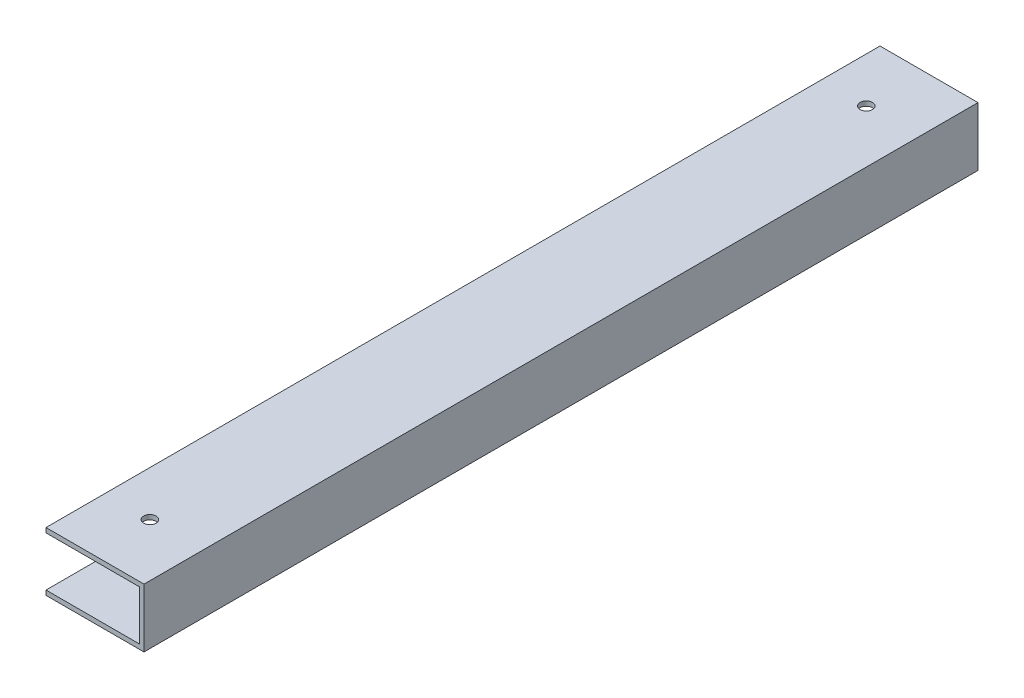
ISO-10303-21;
HEADER;
FILE_DESCRIPTION(('STEP AP214'),'2;1');
FILE_NAME('part.step','',(''),(''),'','','');
FILE_SCHEMA(('AUTOMOTIVE_DESIGN { 1 0 10303 214 1 1 1 1 }'));
ENDSEC;
DATA;
#1=APPLICATION_CONTEXT('core data for automotive mechanical design processes');
#2=APPLICATION_PROTOCOL_DEFINITION('international standard','automotive_design',2000,#1);
#3=PRODUCT_CONTEXT('',#1,'mechanical');
#4=PRODUCT('Part','Part','',(#3));
#5=PRODUCT_RELATED_PRODUCT_CATEGORY('part','',(#4));
#6=PRODUCT_DEFINITION_FORMATION('','',#4);
#7=PRODUCT_DEFINITION_CONTEXT('part definition',#1,'design');
#8=PRODUCT_DEFINITION('design','',#6,#7);
#9=PRODUCT_DEFINITION_SHAPE('','',#8);
#10=(LENGTH_UNIT() NAMED_UNIT(*) SI_UNIT(.MILLI.,.METRE.));
#11=(NAMED_UNIT(*) PLANE_ANGLE_UNIT() SI_UNIT($,.RADIAN.));
#12=(NAMED_UNIT(*) SI_UNIT($,.STERADIAN.) SOLID_ANGLE_UNIT());
#13=UNCERTAINTY_MEASURE_WITH_UNIT(LENGTH_MEASURE(1.E-05),#10,'distance_accuracy_value','');
#14=(GEOMETRIC_REPRESENTATION_CONTEXT(3) GLOBAL_UNCERTAINTY_ASSIGNED_CONTEXT((#13)) GLOBAL_UNIT_ASSIGNED_CONTEXT((#10,
#11,#12)) REPRESENTATION_CONTEXT('',''));
#15=CARTESIAN_POINT('',(0.,0.,0.));
#16=DIRECTION('',(0.,0.,1.));
#17=DIRECTION('',(1.,0.,0.));
#18=AXIS2_PLACEMENT_3D('',#15,#16,#17);
#19=CARTESIAN_POINT('',(-50.,-30.,425.5));
#20=DIRECTION('',(1.,0.,0.));
#21=DIRECTION('',(0.,1.,0.));
#22=AXIS2_PLACEMENT_3D('',#19,#20,#21);
#23=PLANE('',#22);
#24=DIRECTION('',(0.,-1.,0.));
#25=VECTOR('',#24,1.);
#26=CARTESIAN_POINT('',(-50.,-30.,-425.5));
#27=LINE('',#26,#25);
#28=CARTESIAN_POINT('',(-50.,30.,-425.5));
#29=VERTEX_POINT('',#28);
#30=CARTESIAN_POINT('',(-50.,25.2374999999999,-425.5));
#31=VERTEX_POINT('',#30);
#32=EDGE_CURVE('E133',#29,#31,#27,.T.);
#33=ORIENTED_EDGE('',*,*,#32,.T.);
#34=DIRECTION('',(0.,0.,-1.));
#35=VECTOR('',#34,1.);
#36=CARTESIAN_POINT('',(-50.,25.2374999999999,425.5));
#37=LINE('',#36,#35);
#38=CARTESIAN_POINT('',(-50.,25.2374999999999,425.5));
#39=VERTEX_POINT('',#38);
#40=EDGE_CURVE('E126',#39,#31,#37,.T.);
#41=ORIENTED_EDGE('',*,*,#40,.F.);
#42=DIRECTION('',(0.,-1.,0.));
#43=VECTOR('',#42,1.);
#44=CARTESIAN_POINT('',(-50.,-30.,425.5));
#45=LINE('',#44,#43);
#46=CARTESIAN_POINT('',(-50.,30.,425.5));
#47=VERTEX_POINT('',#46);
#48=EDGE_CURVE('E186',#47,#39,#45,.T.);
#49=ORIENTED_EDGE('',*,*,#48,.F.);
#50=DIRECTION('',(0.,0.,-1.));
#51=VECTOR('',#50,1.);
#52=CARTESIAN_POINT('',(-50.,30.,425.5));
#53=LINE('',#52,#51);
#54=EDGE_CURVE('E145',#47,#29,#53,.T.);
#55=ORIENTED_EDGE('',*,*,#54,.T.);
#56=EDGE_LOOP('',(#33,#41,#49,#55));
#57=FACE_BOUND('',#56,.T.);
#58=ADVANCED_FACE('F35',(#57),#23,.F.);
#59=CARTESIAN_POINT('',(-50.,-25.2375,425.5));
#60=VERTEX_POINT('',#59);
#61=CARTESIAN_POINT('',(-50.,-30.,425.5));
#62=VERTEX_POINT('',#61);
#63=EDGE_CURVE('E89',#60,#62,#45,.T.);
#64=ORIENTED_EDGE('',*,*,#63,.F.);
#65=DIRECTION('',(0.,0.,1.));
#66=VECTOR('',#65,1.);
#67=CARTESIAN_POINT('',(-50.,-25.2375,425.5));
#68=LINE('',#67,#66);
#69=CARTESIAN_POINT('',(-50.,-25.2375,-425.5));
#70=VERTEX_POINT('',#69);
#71=EDGE_CURVE('E115',#70,#60,#68,.T.);
#72=ORIENTED_EDGE('',*,*,#71,.F.);
#73=CARTESIAN_POINT('',(-50.,-30.,-425.5));
#74=VERTEX_POINT('',#73);
#75=EDGE_CURVE('E124',#70,#74,#27,.T.);
#76=ORIENTED_EDGE('',*,*,#75,.T.);
#77=DIRECTION('',(0.,0.,-1.));
#78=VECTOR('',#77,1.);
#79=CARTESIAN_POINT('',(-50.,-30.,425.5));
#80=LINE('',#79,#78);
#81=EDGE_CURVE('E152',#62,#74,#80,.T.);
#82=ORIENTED_EDGE('',*,*,#81,.F.);
#83=EDGE_LOOP('',(#64,#72,#76,#82));
#84=FACE_BOUND('',#83,.T.);
#85=ADVANCED_FACE('F37',(#84),#23,.F.);
#86=CARTESIAN_POINT('',(50.,-30.,425.5));
#87=DIRECTION('',(0.,1.,0.));
#88=DIRECTION('',(-1.,0.,0.));
#89=AXIS2_PLACEMENT_3D('',#86,#87,#88);
#90=PLANE('',#89);
#91=CARTESIAN_POINT('',(-3.99999999999997,-30.,-365.5));
#92=DIRECTION('',(0.,1.,0.));
#93=DIRECTION('',(-1.,0.,0.));
#94=AXIS2_PLACEMENT_3D('',#91,#92,#93);
#95=CIRCLE('',#94,6.35);
#96=CARTESIAN_POINT('',(-10.35,-30.,-365.5));
#97=VERTEX_POINT('',#96);
#98=EDGE_CURVE('E127',#97,#97,#95,.T.);
#99=ORIENTED_EDGE('',*,*,#98,.T.);
#100=EDGE_LOOP('',(#99));
#101=FACE_BOUND('',#100,.T.);
#102=CARTESIAN_POINT('',(-3.99999999999997,-30.,365.5));
#103=DIRECTION('',(0.,1.,0.));
#104=DIRECTION('',(-1.,0.,0.));
#105=AXIS2_PLACEMENT_3D('',#102,#103,#104);
#106=CIRCLE('',#105,6.35);
#107=CARTESIAN_POINT('',(-10.35,-30.,365.5));
#108=VERTEX_POINT('',#107);
#109=EDGE_CURVE('E161',#108,#108,#106,.T.);
#110=ORIENTED_EDGE('',*,*,#109,.T.);
#111=EDGE_LOOP('',(#110));
#112=FACE_BOUND('',#111,.T.);
#113=DIRECTION('',(1.,0.,0.));
#114=VECTOR('',#113,1.);
#115=CARTESIAN_POINT('',(50.,-30.,-425.5));
#116=LINE('',#115,#114);
#117=CARTESIAN_POINT('',(50.,-30.,-425.5));
#118=VERTEX_POINT('',#117);
#119=EDGE_CURVE('E131',#74,#118,#116,.T.);
#120=ORIENTED_EDGE('',*,*,#119,.T.);
#121=DIRECTION('',(0.,0.,-1.));
#122=VECTOR('',#121,1.);
#123=CARTESIAN_POINT('',(50.,-30.,425.5));
#124=LINE('',#123,#122);
#125=CARTESIAN_POINT('',(50.,-30.,425.5));
#126=VERTEX_POINT('',#125);
#127=EDGE_CURVE('E149',#126,#118,#124,.T.);
#128=ORIENTED_EDGE('',*,*,#127,.F.);
#129=DIRECTION('',(1.,0.,0.));
#130=VECTOR('',#129,1.);
#131=CARTESIAN_POINT('',(50.,-30.,425.5));
#132=LINE('',#131,#130);
#133=EDGE_CURVE('E188',#62,#126,#132,.T.);
#134=ORIENTED_EDGE('',*,*,#133,.F.);
#135=ORIENTED_EDGE('',*,*,#81,.T.);
#136=EDGE_LOOP('',(#120,#128,#134,#135));
#137=FACE_BOUND('',#136,.T.);
#138=ADVANCED_FACE('F220',(#101,#112,#137),#90,.F.);
#139=CARTESIAN_POINT('',(50.,-30.,425.5));
#140=DIRECTION('',(-1.,0.,0.));
#141=DIRECTION('',(0.,0.,1.));
#142=AXIS2_PLACEMENT_3D('',#139,#140,#141);
#143=PLANE('',#142);
#144=DIRECTION('',(0.,1.,0.));
#145=VECTOR('',#144,1.);
#146=CARTESIAN_POINT('',(50.,-30.,-425.5));
#147=LINE('',#146,#145);
#148=CARTESIAN_POINT('',(50.,30.,-425.5));
#149=VERTEX_POINT('',#148);
#150=EDGE_CURVE('E142',#118,#149,#147,.T.);
#151=ORIENTED_EDGE('',*,*,#150,.T.);
#152=DIRECTION('',(0.,0.,-1.));
#153=VECTOR('',#152,1.);
#154=CARTESIAN_POINT('',(50.,30.,425.5));
#155=LINE('',#154,#153);
#156=CARTESIAN_POINT('',(50.,30.,425.5));
#157=VERTEX_POINT('',#156);
#158=EDGE_CURVE('E147',#157,#149,#155,.T.);
#159=ORIENTED_EDGE('',*,*,#158,.F.);
#160=DIRECTION('',(0.,1.,0.));
#161=VECTOR('',#160,1.);
#162=CARTESIAN_POINT('',(50.,-30.,425.5));
#163=LINE('',#162,#161);
#164=EDGE_CURVE('E189',#126,#157,#163,.T.);
#165=ORIENTED_EDGE('',*,*,#164,.F.);
#166=ORIENTED_EDGE('',*,*,#127,.T.);
#167=EDGE_LOOP('',(#151,#159,#165,#166));
#168=FACE_BOUND('',#167,.T.);
#169=ADVANCED_FACE('F195',(#168),#143,.F.);
#170=CARTESIAN_POINT('',(50.,30.,425.5));
#171=DIRECTION('',(0.,-1.,0.));
#172=DIRECTION('',(1.,0.,0.));
#173=AXIS2_PLACEMENT_3D('',#170,#171,#172);
#174=PLANE('',#173);
#175=CARTESIAN_POINT('',(-3.99999999999999,30.,-365.5));
#176=DIRECTION('',(0.,1.,0.));
#177=DIRECTION('',(-1.,0.,0.));
#178=AXIS2_PLACEMENT_3D('',#175,#176,#177);
#179=CIRCLE('',#178,6.35);
#180=CARTESIAN_POINT('',(-10.35,30.,-365.5));
#181=VERTEX_POINT('',#180);
#182=EDGE_CURVE('E157',#181,#181,#179,.T.);
#183=ORIENTED_EDGE('',*,*,#182,.F.);
#184=EDGE_LOOP('',(#183));
#185=FACE_BOUND('',#184,.T.);
#186=CARTESIAN_POINT('',(-3.99999999999999,30.,365.5));
#187=DIRECTION('',(0.,1.,0.));
#188=DIRECTION('',(1.,0.,0.));
#189=AXIS2_PLACEMENT_3D('',#186,#187,#188);
#190=CIRCLE('',#189,6.35);
#191=CARTESIAN_POINT('',(2.35,30.,365.5));
#192=VERTEX_POINT('',#191);
#193=EDGE_CURVE('E164',#192,#192,#190,.T.);
#194=ORIENTED_EDGE('',*,*,#193,.F.);
#195=EDGE_LOOP('',(#194));
#196=FACE_BOUND('',#195,.T.);
#197=DIRECTION('',(-1.,0.,0.));
#198=VECTOR('',#197,1.);
#199=CARTESIAN_POINT('',(50.,30.,-425.5));
#200=LINE('',#199,#198);
#201=EDGE_CURVE('E82',#149,#29,#200,.T.);
#202=ORIENTED_EDGE('',*,*,#201,.T.);
#203=ORIENTED_EDGE('',*,*,#54,.F.);
#204=DIRECTION('',(-1.,0.,0.));
#205=VECTOR('',#204,1.);
#206=CARTESIAN_POINT('',(50.,30.,425.5));
#207=LINE('',#206,#205);
#208=EDGE_CURVE('E61',#157,#47,#207,.T.);
#209=ORIENTED_EDGE('',*,*,#208,.F.);
#210=ORIENTED_EDGE('',*,*,#158,.T.);
#211=EDGE_LOOP('',(#202,#203,#209,#210));
#212=FACE_BOUND('',#211,.T.);
#213=ADVANCED_FACE('F196',(#185,#196,#212),#174,.F.);
#214=CARTESIAN_POINT('',(0.,0.,425.5));
#215=DIRECTION('',(0.,0.,1.));
#216=DIRECTION('',(1.,0.,0.));
#217=AXIS2_PLACEMENT_3D('',#214,#215,#216);
#218=PLANE('',#217);
#219=ORIENTED_EDGE('',*,*,#48,.T.);
#220=DIRECTION('',(-1.,0.,0.));
#221=VECTOR('',#220,1.);
#222=CARTESIAN_POINT('',(0.,25.2375,425.5));
#223=LINE('',#222,#221);
#224=CARTESIAN_POINT('',(45.2375,25.2375,425.5));
#225=VERTEX_POINT('',#224);
#226=EDGE_CURVE('E181',#225,#39,#223,.T.);
#227=ORIENTED_EDGE('',*,*,#226,.F.);
#228=DIRECTION('',(0.,1.,0.));
#229=VECTOR('',#228,1.);
#230=CARTESIAN_POINT('',(45.2375,0.,425.5));
#231=LINE('',#230,#229);
#232=CARTESIAN_POINT('',(45.2375,-25.2375,425.5));
#233=VERTEX_POINT('',#232);
#234=EDGE_CURVE('E52',#233,#225,#231,.T.);
#235=ORIENTED_EDGE('',*,*,#234,.F.);
#236=DIRECTION('',(1.,0.,0.));
#237=VECTOR('',#236,1.);
#238=CARTESIAN_POINT('',(0.,-25.2375,425.5));
#239=LINE('',#238,#237);
#240=EDGE_CURVE('E183',#60,#233,#239,.T.);
#241=ORIENTED_EDGE('',*,*,#240,.F.);
#242=ORIENTED_EDGE('',*,*,#63,.T.);
#243=ORIENTED_EDGE('',*,*,#133,.T.);
#244=ORIENTED_EDGE('',*,*,#164,.T.);
#245=ORIENTED_EDGE('',*,*,#208,.T.);
#246=EDGE_LOOP('',(#219,#227,#235,#241,#242,#243,#244,#245));
#247=FACE_BOUND('',#246,.T.);
#248=ADVANCED_FACE('F192',(#247),#218,.T.);
#249=CARTESIAN_POINT('',(0.,0.,-425.5));
#250=DIRECTION('',(0.,0.,1.));
#251=DIRECTION('',(1.,0.,0.));
#252=AXIS2_PLACEMENT_3D('',#249,#250,#251);
#253=PLANE('',#252);
#254=DIRECTION('',(-1.,0.,0.));
#255=VECTOR('',#254,1.);
#256=CARTESIAN_POINT('',(0.,25.2375,-425.5));
#257=LINE('',#256,#255);
#258=CARTESIAN_POINT('',(45.2375,25.2375,-425.5));
#259=VERTEX_POINT('',#258);
#260=EDGE_CURVE('E120',#259,#31,#257,.T.);
#261=ORIENTED_EDGE('',*,*,#260,.T.);
#262=ORIENTED_EDGE('',*,*,#32,.F.);
#263=ORIENTED_EDGE('',*,*,#201,.F.);
#264=ORIENTED_EDGE('',*,*,#150,.F.);
#265=ORIENTED_EDGE('',*,*,#119,.F.);
#266=ORIENTED_EDGE('',*,*,#75,.F.);
#267=DIRECTION('',(1.,0.,0.));
#268=VECTOR('',#267,1.);
#269=CARTESIAN_POINT('',(0.,-25.2375,-425.5));
#270=LINE('',#269,#268);
#271=CARTESIAN_POINT('',(45.2375,-25.2375,-425.5));
#272=VERTEX_POINT('',#271);
#273=EDGE_CURVE('E44',#70,#272,#270,.T.);
#274=ORIENTED_EDGE('',*,*,#273,.T.);
#275=DIRECTION('',(0.,1.,0.));
#276=VECTOR('',#275,1.);
#277=CARTESIAN_POINT('',(45.2375,0.,-425.5));
#278=LINE('',#277,#276);
#279=EDGE_CURVE('E11',#272,#259,#278,.T.);
#280=ORIENTED_EDGE('',*,*,#279,.T.);
#281=EDGE_LOOP('',(#261,#262,#263,#264,#265,#266,#274,#280));
#282=FACE_BOUND('',#281,.T.);
#283=ADVANCED_FACE('F129',(#282),#253,.F.);
#284=CARTESIAN_POINT('',(45.2375,0.,-474.5));
#285=DIRECTION('',(1.,0.,0.));
#286=DIRECTION('',(0.,0.,-1.));
#287=AXIS2_PLACEMENT_3D('',#284,#285,#286);
#288=PLANE('',#287);
#289=DIRECTION('',(0.,0.,1.));
#290=VECTOR('',#289,1.);
#291=CARTESIAN_POINT('',(45.2375,-25.2375,-474.5));
#292=LINE('',#291,#290);
#293=EDGE_CURVE('E116',#272,#233,#292,.T.);
#294=ORIENTED_EDGE('',*,*,#293,.T.);
#295=ORIENTED_EDGE('',*,*,#234,.T.);
#296=DIRECTION('',(0.,0.,1.));
#297=VECTOR('',#296,1.);
#298=CARTESIAN_POINT('',(45.2375,25.2375,-474.5));
#299=LINE('',#298,#297);
#300=EDGE_CURVE('E136',#259,#225,#299,.T.);
#301=ORIENTED_EDGE('',*,*,#300,.F.);
#302=ORIENTED_EDGE('',*,*,#279,.F.);
#303=EDGE_LOOP('',(#294,#295,#301,#302));
#304=FACE_BOUND('',#303,.T.);
#305=ADVANCED_FACE('F204',(#304),#288,.F.);
#306=CARTESIAN_POINT('',(0.,-25.2375,-474.5));
#307=DIRECTION('',(0.,-1.,0.));
#308=DIRECTION('',(1.,0.,0.));
#309=AXIS2_PLACEMENT_3D('',#306,#307,#308);
#310=PLANE('',#309);
#311=CARTESIAN_POINT('',(-3.99999999999998,-25.2375,-365.5));
#312=DIRECTION('',(0.,-1.,0.));
#313=DIRECTION('',(1.,0.,0.));
#314=AXIS2_PLACEMENT_3D('',#311,#312,#313);
#315=CIRCLE('',#314,6.35);
#316=CARTESIAN_POINT('',(2.35000000000002,-25.2375,-365.5));
#317=VERTEX_POINT('',#316);
#318=EDGE_CURVE('E173',#317,#317,#315,.T.);
#319=ORIENTED_EDGE('',*,*,#318,.T.);
#320=EDGE_LOOP('',(#319));
#321=FACE_BOUND('',#320,.T.);
#322=CARTESIAN_POINT('',(-3.99999999999998,-25.2375,365.5));
#323=DIRECTION('',(0.,-1.,0.));
#324=DIRECTION('',(1.,0.,0.));
#325=AXIS2_PLACEMENT_3D('',#322,#323,#324);
#326=CIRCLE('',#325,6.35);
#327=CARTESIAN_POINT('',(2.35000000000002,-25.2375,365.5));
#328=VERTEX_POINT('',#327);
#329=EDGE_CURVE('E156',#328,#328,#326,.T.);
#330=ORIENTED_EDGE('',*,*,#329,.T.);
#331=EDGE_LOOP('',(#330));
#332=FACE_BOUND('',#331,.T.);
#333=ORIENTED_EDGE('',*,*,#240,.T.);
#334=ORIENTED_EDGE('',*,*,#293,.F.);
#335=ORIENTED_EDGE('',*,*,#273,.F.);
#336=ORIENTED_EDGE('',*,*,#71,.T.);
#337=EDGE_LOOP('',(#333,#334,#335,#336));
#338=FACE_BOUND('',#337,.T.);
#339=ADVANCED_FACE('F114',(#321,#332,#338),#310,.F.);
#340=CARTESIAN_POINT('',(0.,25.2375,-474.5));
#341=DIRECTION('',(0.,1.,0.));
#342=DIRECTION('',(-1.,0.,0.));
#343=AXIS2_PLACEMENT_3D('',#340,#341,#342);
#344=PLANE('',#343);
#345=CARTESIAN_POINT('',(-3.99999999999999,25.2375,-365.5));
#346=DIRECTION('',(0.,1.,0.));
#347=DIRECTION('',(-1.,0.,0.));
#348=AXIS2_PLACEMENT_3D('',#345,#346,#347);
#349=CIRCLE('',#348,6.35);
#350=CARTESIAN_POINT('',(-10.35,25.2375,-365.5));
#351=VERTEX_POINT('',#350);
#352=EDGE_CURVE('E39',#351,#351,#349,.T.);
#353=ORIENTED_EDGE('',*,*,#352,.T.);
#354=EDGE_LOOP('',(#353));
#355=FACE_BOUND('',#354,.T.);
#356=CARTESIAN_POINT('',(-3.99999999999999,25.2375,365.5));
#357=DIRECTION('',(0.,1.,0.));
#358=DIRECTION('',(-1.,0.,0.));
#359=AXIS2_PLACEMENT_3D('',#356,#357,#358);
#360=CIRCLE('',#359,6.35);
#361=CARTESIAN_POINT('',(-10.35,25.2375,365.5));
#362=VERTEX_POINT('',#361);
#363=EDGE_CURVE('E154',#362,#362,#360,.T.);
#364=ORIENTED_EDGE('',*,*,#363,.T.);
#365=EDGE_LOOP('',(#364));
#366=FACE_BOUND('',#365,.T.);
#367=ORIENTED_EDGE('',*,*,#40,.T.);
#368=ORIENTED_EDGE('',*,*,#260,.F.);
#369=ORIENTED_EDGE('',*,*,#300,.T.);
#370=ORIENTED_EDGE('',*,*,#226,.T.);
#371=EDGE_LOOP('',(#367,#368,#369,#370));
#372=FACE_BOUND('',#371,.T.);
#373=ADVANCED_FACE('F203',(#355,#366,#372),#344,.F.);
#374=CARTESIAN_POINT('',(-3.99999999999997,-50.,365.5));
#375=DIRECTION('',(0.,1.,0.));
#376=DIRECTION('',(-1.,0.,0.));
#377=AXIS2_PLACEMENT_3D('',#374,#375,#376);
#378=CYLINDRICAL_SURFACE('',#377,6.35);
#379=ORIENTED_EDGE('',*,*,#193,.T.);
#380=EDGE_LOOP('',(#379));
#381=FACE_BOUND('',#380,.T.);
#382=ORIENTED_EDGE('',*,*,#363,.F.);
#383=EDGE_LOOP('',(#382));
#384=FACE_BOUND('',#383,.T.);
#385=ADVANCED_FACE('F270',(#381,#384),#378,.F.);
#386=CARTESIAN_POINT('',(-3.99999999999997,-50.,-365.5));
#387=DIRECTION('',(0.,1.,0.));
#388=DIRECTION('',(-1.,0.,0.));
#389=AXIS2_PLACEMENT_3D('',#386,#387,#388);
#390=CYLINDRICAL_SURFACE('',#389,6.35);
#391=ORIENTED_EDGE('',*,*,#182,.T.);
#392=EDGE_LOOP('',(#391));
#393=FACE_BOUND('',#392,.T.);
#394=ORIENTED_EDGE('',*,*,#352,.F.);
#395=EDGE_LOOP('',(#394));
#396=FACE_BOUND('',#395,.T.);
#397=ADVANCED_FACE('F280',(#393,#396),#390,.F.);
#398=ORIENTED_EDGE('',*,*,#329,.F.);
#399=EDGE_LOOP('',(#398));
#400=FACE_BOUND('',#399,.T.);
#401=ORIENTED_EDGE('',*,*,#109,.F.);
#402=EDGE_LOOP('',(#401));
#403=FACE_BOUND('',#402,.T.);
#404=ADVANCED_FACE('F283',(#400,#403),#378,.F.);
#405=ORIENTED_EDGE('',*,*,#318,.F.);
#406=EDGE_LOOP('',(#405));
#407=FACE_BOUND('',#406,.T.);
#408=ORIENTED_EDGE('',*,*,#98,.F.);
#409=EDGE_LOOP('',(#408));
#410=FACE_BOUND('',#409,.T.);
#411=ADVANCED_FACE('F292',(#407,#410),#390,.F.);
#412=CLOSED_SHELL('',(#58,#85,#138,#169,#213,#248,#283,#305,#339,#373,#385,#397,#404,#411));
#413=MANIFOLD_SOLID_BREP('B2',#412);
#414=ADVANCED_BREP_SHAPE_REPRESENTATION('',(#18,#413),#14);
#415=SHAPE_DEFINITION_REPRESENTATION(#9,#414);
ENDSEC;
END-ISO-10303-21;
